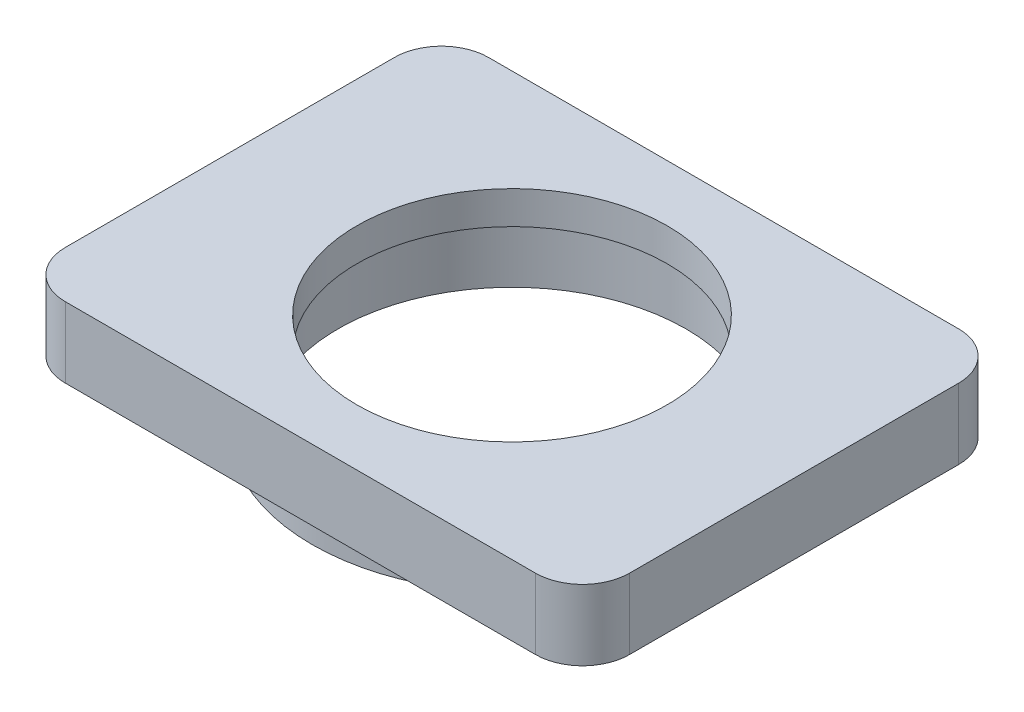
ISO-10303-21;
HEADER;
FILE_DESCRIPTION(('STEP AP214'),'2;1');
FILE_NAME('part.step','',(''),(''),'','','');
FILE_SCHEMA(('AUTOMOTIVE_DESIGN { 1 0 10303 214 1 1 1 1 }'));
ENDSEC;
DATA;
#1=APPLICATION_CONTEXT('core data for automotive mechanical design processes');
#2=APPLICATION_PROTOCOL_DEFINITION('international standard','automotive_design',2000,#1);
#3=PRODUCT_CONTEXT('',#1,'mechanical');
#4=PRODUCT('Part','Part','',(#3));
#5=PRODUCT_RELATED_PRODUCT_CATEGORY('part','',(#4));
#6=PRODUCT_DEFINITION_FORMATION('','',#4);
#7=PRODUCT_DEFINITION_CONTEXT('part definition',#1,'design');
#8=PRODUCT_DEFINITION('design','',#6,#7);
#9=PRODUCT_DEFINITION_SHAPE('','',#8);
#10=(LENGTH_UNIT() NAMED_UNIT(*) SI_UNIT(.MILLI.,.METRE.));
#11=(NAMED_UNIT(*) PLANE_ANGLE_UNIT() SI_UNIT($,.RADIAN.));
#12=(NAMED_UNIT(*) SI_UNIT($,.STERADIAN.) SOLID_ANGLE_UNIT());
#13=UNCERTAINTY_MEASURE_WITH_UNIT(LENGTH_MEASURE(1.E-05),#10,'distance_accuracy_value','');
#14=(GEOMETRIC_REPRESENTATION_CONTEXT(3) GLOBAL_UNCERTAINTY_ASSIGNED_CONTEXT((#13)) GLOBAL_UNIT_ASSIGNED_CONTEXT((#10,
#11,#12)) REPRESENTATION_CONTEXT('',''));
#15=CARTESIAN_POINT('',(0.,0.,0.));
#16=DIRECTION('',(0.,0.,1.));
#17=DIRECTION('',(1.,0.,0.));
#18=AXIS2_PLACEMENT_3D('',#15,#16,#17);
#19=CARTESIAN_POINT('',(0.,10.5,0.));
#20=DIRECTION('',(0.,-1.,0.));
#21=DIRECTION('',(0.,0.,-1.));
#22=AXIS2_PLACEMENT_3D('',#19,#20,#21);
#23=CYLINDRICAL_SURFACE('',#22,16.5);
#24=CARTESIAN_POINT('',(0.,10.5,0.));
#25=DIRECTION('',(0.,1.,0.));
#26=DIRECTION('',(0.,0.,1.));
#27=AXIS2_PLACEMENT_3D('',#24,#25,#26);
#28=CIRCLE('',#27,16.5);
#29=CARTESIAN_POINT('',(0.,10.5,16.5));
#30=VERTEX_POINT('',#29);
#31=EDGE_CURVE('E164',#30,#30,#28,.T.);
#32=ORIENTED_EDGE('',*,*,#31,.T.);
#33=EDGE_LOOP('',(#32));
#34=FACE_BOUND('',#33,.T.);
#35=CARTESIAN_POINT('',(0.,7.,0.));
#36=DIRECTION('',(0.,-1.,0.));
#37=DIRECTION('',(0.,0.,-1.));
#38=AXIS2_PLACEMENT_3D('',#35,#36,#37);
#39=CIRCLE('',#38,16.5);
#40=CARTESIAN_POINT('',(0.,7.,-16.5));
#41=VERTEX_POINT('',#40);
#42=EDGE_CURVE('E38',#41,#41,#39,.T.);
#43=ORIENTED_EDGE('',*,*,#42,.T.);
#44=EDGE_LOOP('',(#43));
#45=FACE_BOUND('',#44,.T.);
#46=ADVANCED_FACE('F34',(#34,#45),#23,.F.);
#47=CARTESIAN_POINT('',(0.,0.,0.));
#48=DIRECTION('',(0.,1.,0.));
#49=DIRECTION('',(0.,0.,1.));
#50=AXIS2_PLACEMENT_3D('',#47,#48,#49);
#51=PLANE('',#50);
#52=CARTESIAN_POINT('',(0.,0.,0.));
#53=DIRECTION('',(0.,1.,0.));
#54=DIRECTION('',(0.,0.,1.));
#55=AXIS2_PLACEMENT_3D('',#52,#53,#54);
#56=CIRCLE('',#55,21.25);
#57=CARTESIAN_POINT('',(0.,0.,21.25));
#58=VERTEX_POINT('',#57);
#59=EDGE_CURVE('E128',#58,#58,#56,.T.);
#60=ORIENTED_EDGE('',*,*,#59,.F.);
#61=EDGE_LOOP('',(#60));
#62=FACE_BOUND('',#61,.T.);
#63=CARTESIAN_POINT('',(0.,0.,0.));
#64=DIRECTION('',(0.,1.,0.));
#65=DIRECTION('',(0.,0.,1.));
#66=AXIS2_PLACEMENT_3D('',#63,#64,#65);
#67=CIRCLE('',#66,18.5);
#68=CARTESIAN_POINT('',(0.,0.,18.5));
#69=VERTEX_POINT('',#68);
#70=EDGE_CURVE('E133',#69,#69,#67,.T.);
#71=ORIENTED_EDGE('',*,*,#70,.T.);
#72=EDGE_LOOP('',(#71));
#73=FACE_BOUND('',#72,.T.);
#74=ADVANCED_FACE('F181',(#62,#73),#51,.F.);
#75=CARTESIAN_POINT('',(0.,8.,0.));
#76=DIRECTION('',(0.,-1.,0.));
#77=DIRECTION('',(0.,0.,-1.));
#78=AXIS2_PLACEMENT_3D('',#75,#76,#77);
#79=CYLINDRICAL_SURFACE('',#78,21.25);
#80=CARTESIAN_POINT('',(0.,3.,0.));
#81=DIRECTION('',(0.,-1.,0.));
#82=DIRECTION('',(0.,0.,-1.));
#83=AXIS2_PLACEMENT_3D('',#80,#81,#82);
#84=CIRCLE('',#83,21.25);
#85=CARTESIAN_POINT('',(0.,3.,-21.25));
#86=VERTEX_POINT('',#85);
#87=EDGE_CURVE('E160',#86,#86,#84,.T.);
#88=ORIENTED_EDGE('',*,*,#87,.T.);
#89=EDGE_LOOP('',(#88));
#90=FACE_BOUND('',#89,.T.);
#91=ORIENTED_EDGE('',*,*,#59,.T.);
#92=EDGE_LOOP('',(#91));
#93=FACE_BOUND('',#92,.T.);
#94=ADVANCED_FACE('F187',(#90,#93),#79,.T.);
#95=CARTESIAN_POINT('',(0.,8.,0.));
#96=DIRECTION('',(0.,-1.,0.));
#97=DIRECTION('',(0.,0.,-1.));
#98=AXIS2_PLACEMENT_3D('',#95,#96,#97);
#99=CYLINDRICAL_SURFACE('',#98,18.5);
#100=ORIENTED_EDGE('',*,*,#70,.F.);
#101=EDGE_LOOP('',(#100));
#102=FACE_BOUND('',#101,.T.);
#103=CARTESIAN_POINT('',(0.,7.,0.));
#104=DIRECTION('',(0.,-1.,0.));
#105=DIRECTION('',(0.,0.,-1.));
#106=AXIS2_PLACEMENT_3D('',#103,#104,#105);
#107=CIRCLE('',#106,18.5);
#108=CARTESIAN_POINT('',(0.,7.,-18.5));
#109=VERTEX_POINT('',#108);
#110=EDGE_CURVE('E191',#109,#109,#107,.T.);
#111=ORIENTED_EDGE('',*,*,#110,.F.);
#112=EDGE_LOOP('',(#111));
#113=FACE_BOUND('',#112,.T.);
#114=ADVANCED_FACE('F183',(#102,#113),#99,.F.);
#115=CARTESIAN_POINT('',(0.,3.,0.));
#116=DIRECTION('',(0.,-1.,0.));
#117=DIRECTION('',(0.,0.,-1.));
#118=AXIS2_PLACEMENT_3D('',#115,#116,#117);
#119=PLANE('',#118);
#120=CARTESIAN_POINT('',(-25.,3.,-17.5));
#121=DIRECTION('',(0.,-1.,0.));
#122=DIRECTION('',(0.,0.,-1.));
#123=AXIS2_PLACEMENT_3D('',#120,#121,#122);
#124=CIRCLE('',#123,1.75);
#125=CARTESIAN_POINT('',(-25.,3.,-19.25));
#126=VERTEX_POINT('',#125);
#127=EDGE_CURVE('E408',#126,#126,#124,.T.);
#128=ORIENTED_EDGE('',*,*,#127,.F.);
#129=EDGE_LOOP('',(#128));
#130=FACE_BOUND('',#129,.T.);
#131=CARTESIAN_POINT('',(25.,3.,-17.5));
#132=DIRECTION('',(0.,-1.,0.));
#133=DIRECTION('',(0.,0.,-1.));
#134=AXIS2_PLACEMENT_3D('',#131,#132,#133);
#135=CIRCLE('',#134,1.75);
#136=CARTESIAN_POINT('',(25.,3.,-19.25));
#137=VERTEX_POINT('',#136);
#138=EDGE_CURVE('E407',#137,#137,#135,.T.);
#139=ORIENTED_EDGE('',*,*,#138,.F.);
#140=EDGE_LOOP('',(#139));
#141=FACE_BOUND('',#140,.T.);
#142=CARTESIAN_POINT('',(25.,3.,17.5));
#143=DIRECTION('',(0.,-1.,0.));
#144=DIRECTION('',(0.,0.,-1.));
#145=AXIS2_PLACEMENT_3D('',#142,#143,#144);
#146=CIRCLE('',#145,1.75);
#147=CARTESIAN_POINT('',(25.,3.,15.75));
#148=VERTEX_POINT('',#147);
#149=EDGE_CURVE('E418',#148,#148,#146,.T.);
#150=ORIENTED_EDGE('',*,*,#149,.F.);
#151=EDGE_LOOP('',(#150));
#152=FACE_BOUND('',#151,.T.);
#153=CARTESIAN_POINT('',(-25.,3.,17.5));
#154=DIRECTION('',(0.,-1.,0.));
#155=DIRECTION('',(0.,0.,-1.));
#156=AXIS2_PLACEMENT_3D('',#153,#154,#155);
#157=CIRCLE('',#156,1.75);
#158=CARTESIAN_POINT('',(-25.,3.,15.75));
#159=VERTEX_POINT('',#158);
#160=EDGE_CURVE('E197',#159,#159,#157,.T.);
#161=ORIENTED_EDGE('',*,*,#160,.F.);
#162=EDGE_LOOP('',(#161));
#163=FACE_BOUND('',#162,.T.);
#164=ORIENTED_EDGE('',*,*,#87,.F.);
#165=EDGE_LOOP('',(#164));
#166=FACE_BOUND('',#165,.T.);
#167=DIRECTION('',(-1.,0.,0.));
#168=VECTOR('',#167,1.);
#169=CARTESIAN_POINT('',(-30.,3.,-22.5));
#170=LINE('',#169,#168);
#171=CARTESIAN_POINT('',(25.,3.,-22.5));
#172=VERTEX_POINT('',#171);
#173=CARTESIAN_POINT('',(-25.,3.,-22.5));
#174=VERTEX_POINT('',#173);
#175=EDGE_CURVE('E166',#172,#174,#170,.T.);
#176=ORIENTED_EDGE('',*,*,#175,.F.);
#177=CARTESIAN_POINT('',(25.,3.,-17.5));
#178=DIRECTION('',(0.,-1.,0.));
#179=DIRECTION('',(0.,0.,-1.));
#180=AXIS2_PLACEMENT_3D('',#177,#178,#179);
#181=CIRCLE('',#180,5.);
#182=CARTESIAN_POINT('',(30.,3.,-17.5));
#183=VERTEX_POINT('',#182);
#184=EDGE_CURVE('E149',#172,#183,#181,.T.);
#185=ORIENTED_EDGE('',*,*,#184,.T.);
#186=DIRECTION('',(0.,0.,-1.));
#187=VECTOR('',#186,1.);
#188=CARTESIAN_POINT('',(30.,3.,22.5));
#189=LINE('',#188,#187);
#190=CARTESIAN_POINT('',(30.,3.,17.5));
#191=VERTEX_POINT('',#190);
#192=EDGE_CURVE('E175',#191,#183,#189,.T.);
#193=ORIENTED_EDGE('',*,*,#192,.F.);
#194=CARTESIAN_POINT('',(25.,3.,17.5));
#195=DIRECTION('',(0.,-1.,0.));
#196=DIRECTION('',(0.,0.,-1.));
#197=AXIS2_PLACEMENT_3D('',#194,#195,#196);
#198=CIRCLE('',#197,5.);
#199=CARTESIAN_POINT('',(25.,3.,22.5));
#200=VERTEX_POINT('',#199);
#201=EDGE_CURVE('E127',#191,#200,#198,.T.);
#202=ORIENTED_EDGE('',*,*,#201,.T.);
#203=DIRECTION('',(1.,0.,0.));
#204=VECTOR('',#203,1.);
#205=CARTESIAN_POINT('',(-30.,3.,22.5));
#206=LINE('',#205,#204);
#207=CARTESIAN_POINT('',(-25.,3.,22.5));
#208=VERTEX_POINT('',#207);
#209=EDGE_CURVE('E159',#208,#200,#206,.T.);
#210=ORIENTED_EDGE('',*,*,#209,.F.);
#211=CARTESIAN_POINT('',(-25.,3.,17.5));
#212=DIRECTION('',(0.,-1.,0.));
#213=DIRECTION('',(0.,0.,-1.));
#214=AXIS2_PLACEMENT_3D('',#211,#212,#213);
#215=CIRCLE('',#214,5.);
#216=CARTESIAN_POINT('',(-30.,3.,17.5));
#217=VERTEX_POINT('',#216);
#218=EDGE_CURVE('E50',#208,#217,#215,.T.);
#219=ORIENTED_EDGE('',*,*,#218,.T.);
#220=DIRECTION('',(0.,0.,1.));
#221=VECTOR('',#220,1.);
#222=CARTESIAN_POINT('',(-30.,3.,22.5));
#223=LINE('',#222,#221);
#224=CARTESIAN_POINT('',(-30.,3.,-17.5));
#225=VERTEX_POINT('',#224);
#226=EDGE_CURVE('E161',#225,#217,#223,.T.);
#227=ORIENTED_EDGE('',*,*,#226,.F.);
#228=CARTESIAN_POINT('',(-25.,3.,-17.5));
#229=DIRECTION('',(0.,-1.,0.));
#230=DIRECTION('',(0.,0.,-1.));
#231=AXIS2_PLACEMENT_3D('',#228,#229,#230);
#232=CIRCLE('',#231,5.);
#233=EDGE_CURVE('E145',#225,#174,#232,.T.);
#234=ORIENTED_EDGE('',*,*,#233,.T.);
#235=EDGE_LOOP('',(#176,#185,#193,#202,#210,#219,#227,#234));
#236=FACE_BOUND('',#235,.T.);
#237=ADVANCED_FACE('F186',(#130,#141,#152,#163,#166,#236),#119,.T.);
#238=CARTESIAN_POINT('',(-30.,3.,-22.5));
#239=DIRECTION('',(0.,0.,-1.));
#240=DIRECTION('',(-1.,0.,0.));
#241=AXIS2_PLACEMENT_3D('',#238,#239,#240);
#242=PLANE('',#241);
#243=DIRECTION('',(-1.,0.,0.));
#244=VECTOR('',#243,1.);
#245=CARTESIAN_POINT('',(-30.,10.5,-22.5));
#246=LINE('',#245,#244);
#247=CARTESIAN_POINT('',(25.,10.5,-22.5));
#248=VERTEX_POINT('',#247);
#249=CARTESIAN_POINT('',(-25.,10.5,-22.5));
#250=VERTEX_POINT('',#249);
#251=EDGE_CURVE('E123',#248,#250,#246,.T.);
#252=ORIENTED_EDGE('',*,*,#251,.F.);
#253=DIRECTION('',(0.,1.,0.));
#254=VECTOR('',#253,1.);
#255=CARTESIAN_POINT('',(25.,3.,-22.5));
#256=LINE('',#255,#254);
#257=EDGE_CURVE('E143',#248,#172,#256,.F.);
#258=ORIENTED_EDGE('',*,*,#257,.T.);
#259=ORIENTED_EDGE('',*,*,#175,.T.);
#260=DIRECTION('',(0.,1.,0.));
#261=VECTOR('',#260,1.);
#262=CARTESIAN_POINT('',(-25.,3.,-22.5));
#263=LINE('',#262,#261);
#264=EDGE_CURVE('E140',#174,#250,#263,.T.);
#265=ORIENTED_EDGE('',*,*,#264,.T.);
#266=EDGE_LOOP('',(#252,#258,#259,#265));
#267=FACE_BOUND('',#266,.T.);
#268=ADVANCED_FACE('F206',(#267),#242,.T.);
#269=CARTESIAN_POINT('',(-30.,3.,22.5));
#270=DIRECTION('',(-1.,0.,0.));
#271=DIRECTION('',(0.,0.,1.));
#272=AXIS2_PLACEMENT_3D('',#269,#270,#271);
#273=PLANE('',#272);
#274=ORIENTED_EDGE('',*,*,#226,.T.);
#275=DIRECTION('',(0.,1.,0.));
#276=VECTOR('',#275,1.);
#277=CARTESIAN_POINT('',(-30.,3.,17.5));
#278=LINE('',#277,#276);
#279=CARTESIAN_POINT('',(-30.,10.5,17.5));
#280=VERTEX_POINT('',#279);
#281=EDGE_CURVE('E11',#217,#280,#278,.T.);
#282=ORIENTED_EDGE('',*,*,#281,.T.);
#283=DIRECTION('',(0.,0.,1.));
#284=VECTOR('',#283,1.);
#285=CARTESIAN_POINT('',(-30.,10.5,22.5));
#286=LINE('',#285,#284);
#287=CARTESIAN_POINT('',(-30.,10.5,-17.5));
#288=VERTEX_POINT('',#287);
#289=EDGE_CURVE('E172',#288,#280,#286,.T.);
#290=ORIENTED_EDGE('',*,*,#289,.F.);
#291=DIRECTION('',(0.,1.,0.));
#292=VECTOR('',#291,1.);
#293=CARTESIAN_POINT('',(-30.,3.,-17.5));
#294=LINE('',#293,#292);
#295=EDGE_CURVE('E43',#288,#225,#294,.F.);
#296=ORIENTED_EDGE('',*,*,#295,.T.);
#297=EDGE_LOOP('',(#274,#282,#290,#296));
#298=FACE_BOUND('',#297,.T.);
#299=ADVANCED_FACE('F211',(#298),#273,.T.);
#300=CARTESIAN_POINT('',(-30.,3.,22.5));
#301=DIRECTION('',(0.,0.,1.));
#302=DIRECTION('',(1.,0.,0.));
#303=AXIS2_PLACEMENT_3D('',#300,#301,#302);
#304=PLANE('',#303);
#305=ORIENTED_EDGE('',*,*,#209,.T.);
#306=DIRECTION('',(0.,1.,0.));
#307=VECTOR('',#306,1.);
#308=CARTESIAN_POINT('',(25.,3.,22.5));
#309=LINE('',#308,#307);
#310=CARTESIAN_POINT('',(25.,10.5,22.5));
#311=VERTEX_POINT('',#310);
#312=EDGE_CURVE('E153',#200,#311,#309,.T.);
#313=ORIENTED_EDGE('',*,*,#312,.T.);
#314=DIRECTION('',(1.,0.,0.));
#315=VECTOR('',#314,1.);
#316=CARTESIAN_POINT('',(-30.,10.5,22.5));
#317=LINE('',#316,#315);
#318=CARTESIAN_POINT('',(-25.,10.5,22.5));
#319=VERTEX_POINT('',#318);
#320=EDGE_CURVE('E107',#319,#311,#317,.T.);
#321=ORIENTED_EDGE('',*,*,#320,.F.);
#322=DIRECTION('',(0.,1.,0.));
#323=VECTOR('',#322,1.);
#324=CARTESIAN_POINT('',(-25.,3.,22.5));
#325=LINE('',#324,#323);
#326=EDGE_CURVE('E151',#319,#208,#325,.F.);
#327=ORIENTED_EDGE('',*,*,#326,.T.);
#328=EDGE_LOOP('',(#305,#313,#321,#327));
#329=FACE_BOUND('',#328,.T.);
#330=ADVANCED_FACE('F157',(#329),#304,.T.);
#331=CARTESIAN_POINT('',(30.,3.,22.5));
#332=DIRECTION('',(1.,0.,0.));
#333=DIRECTION('',(0.,0.,-1.));
#334=AXIS2_PLACEMENT_3D('',#331,#332,#333);
#335=PLANE('',#334);
#336=ORIENTED_EDGE('',*,*,#192,.T.);
#337=DIRECTION('',(0.,1.,0.));
#338=VECTOR('',#337,1.);
#339=CARTESIAN_POINT('',(30.,3.,-17.5));
#340=LINE('',#339,#338);
#341=CARTESIAN_POINT('',(30.,10.5,-17.5));
#342=VERTEX_POINT('',#341);
#343=EDGE_CURVE('E122',#183,#342,#340,.T.);
#344=ORIENTED_EDGE('',*,*,#343,.T.);
#345=DIRECTION('',(0.,0.,-1.));
#346=VECTOR('',#345,1.);
#347=CARTESIAN_POINT('',(30.,10.5,22.5));
#348=LINE('',#347,#346);
#349=CARTESIAN_POINT('',(30.,10.5,17.5));
#350=VERTEX_POINT('',#349);
#351=EDGE_CURVE('E105',#350,#342,#348,.T.);
#352=ORIENTED_EDGE('',*,*,#351,.F.);
#353=DIRECTION('',(0.,1.,0.));
#354=VECTOR('',#353,1.);
#355=CARTESIAN_POINT('',(30.,3.,17.5));
#356=LINE('',#355,#354);
#357=EDGE_CURVE('E119',#350,#191,#356,.F.);
#358=ORIENTED_EDGE('',*,*,#357,.T.);
#359=EDGE_LOOP('',(#336,#344,#352,#358));
#360=FACE_BOUND('',#359,.T.);
#361=ADVANCED_FACE('F118',(#360),#335,.T.);
#362=CARTESIAN_POINT('',(0.,10.5,0.));
#363=DIRECTION('',(0.,1.,0.));
#364=DIRECTION('',(0.,0.,1.));
#365=AXIS2_PLACEMENT_3D('',#362,#363,#364);
#366=PLANE('',#365);
#367=ORIENTED_EDGE('',*,*,#351,.T.);
#368=CARTESIAN_POINT('',(25.,10.5,-17.5));
#369=DIRECTION('',(0.,1.,0.));
#370=DIRECTION('',(0.,0.,1.));
#371=AXIS2_PLACEMENT_3D('',#368,#369,#370);
#372=CIRCLE('',#371,5.);
#373=EDGE_CURVE('E112',#342,#248,#372,.T.);
#374=ORIENTED_EDGE('',*,*,#373,.T.);
#375=ORIENTED_EDGE('',*,*,#251,.T.);
#376=CARTESIAN_POINT('',(-25.,10.5,-17.5));
#377=DIRECTION('',(0.,1.,0.));
#378=DIRECTION('',(0.,0.,1.));
#379=AXIS2_PLACEMENT_3D('',#376,#377,#378);
#380=CIRCLE('',#379,5.);
#381=EDGE_CURVE('E130',#250,#288,#380,.T.);
#382=ORIENTED_EDGE('',*,*,#381,.T.);
#383=ORIENTED_EDGE('',*,*,#289,.T.);
#384=CARTESIAN_POINT('',(-25.,10.5,17.5));
#385=DIRECTION('',(0.,1.,0.));
#386=DIRECTION('',(0.,0.,1.));
#387=AXIS2_PLACEMENT_3D('',#384,#385,#386);
#388=CIRCLE('',#387,5.);
#389=EDGE_CURVE('E113',#280,#319,#388,.T.);
#390=ORIENTED_EDGE('',*,*,#389,.T.);
#391=ORIENTED_EDGE('',*,*,#320,.T.);
#392=CARTESIAN_POINT('',(25.,10.5,17.5));
#393=DIRECTION('',(0.,1.,0.));
#394=DIRECTION('',(0.,0.,1.));
#395=AXIS2_PLACEMENT_3D('',#392,#393,#394);
#396=CIRCLE('',#395,5.);
#397=EDGE_CURVE('E101',#311,#350,#396,.T.);
#398=ORIENTED_EDGE('',*,*,#397,.T.);
#399=EDGE_LOOP('',(#367,#374,#375,#382,#383,#390,#391,#398));
#400=FACE_BOUND('',#399,.T.);
#401=ORIENTED_EDGE('',*,*,#31,.F.);
#402=EDGE_LOOP('',(#401));
#403=FACE_BOUND('',#402,.T.);
#404=ADVANCED_FACE('F103',(#400,#403),#366,.T.);
#405=CARTESIAN_POINT('',(25.,3.,-17.5));
#406=DIRECTION('',(0.,1.,0.));
#407=DIRECTION('',(0.,0.,1.));
#408=AXIS2_PLACEMENT_3D('',#405,#406,#407);
#409=CYLINDRICAL_SURFACE('',#408,5.);
#410=ORIENTED_EDGE('',*,*,#184,.F.);
#411=ORIENTED_EDGE('',*,*,#257,.F.);
#412=ORIENTED_EDGE('',*,*,#373,.F.);
#413=ORIENTED_EDGE('',*,*,#343,.F.);
#414=EDGE_LOOP('',(#410,#411,#412,#413));
#415=FACE_BOUND('',#414,.T.);
#416=ADVANCED_FACE('F221',(#415),#409,.T.);
#417=CARTESIAN_POINT('',(25.,3.,17.5));
#418=DIRECTION('',(0.,1.,0.));
#419=DIRECTION('',(0.,0.,1.));
#420=AXIS2_PLACEMENT_3D('',#417,#418,#419);
#421=CYLINDRICAL_SURFACE('',#420,5.);
#422=ORIENTED_EDGE('',*,*,#201,.F.);
#423=ORIENTED_EDGE('',*,*,#357,.F.);
#424=ORIENTED_EDGE('',*,*,#397,.F.);
#425=ORIENTED_EDGE('',*,*,#312,.F.);
#426=EDGE_LOOP('',(#422,#423,#424,#425));
#427=FACE_BOUND('',#426,.T.);
#428=ADVANCED_FACE('F126',(#427),#421,.T.);
#429=CARTESIAN_POINT('',(-25.,3.,17.5));
#430=DIRECTION('',(0.,1.,0.));
#431=DIRECTION('',(0.,0.,1.));
#432=AXIS2_PLACEMENT_3D('',#429,#430,#431);
#433=CYLINDRICAL_SURFACE('',#432,5.);
#434=ORIENTED_EDGE('',*,*,#218,.F.);
#435=ORIENTED_EDGE('',*,*,#326,.F.);
#436=ORIENTED_EDGE('',*,*,#389,.F.);
#437=ORIENTED_EDGE('',*,*,#281,.F.);
#438=EDGE_LOOP('',(#434,#435,#436,#437));
#439=FACE_BOUND('',#438,.T.);
#440=ADVANCED_FACE('F214',(#439),#433,.T.);
#441=CARTESIAN_POINT('',(-25.,3.,-17.5));
#442=DIRECTION('',(0.,1.,0.));
#443=DIRECTION('',(0.,0.,1.));
#444=AXIS2_PLACEMENT_3D('',#441,#442,#443);
#445=CYLINDRICAL_SURFACE('',#444,5.);
#446=ORIENTED_EDGE('',*,*,#233,.F.);
#447=ORIENTED_EDGE('',*,*,#295,.F.);
#448=ORIENTED_EDGE('',*,*,#381,.F.);
#449=ORIENTED_EDGE('',*,*,#264,.F.);
#450=EDGE_LOOP('',(#446,#447,#448,#449));
#451=FACE_BOUND('',#450,.T.);
#452=ADVANCED_FACE('F36',(#451),#445,.T.);
#453=CARTESIAN_POINT('',(0.,7.,0.));
#454=DIRECTION('',(0.,-1.,0.));
#455=DIRECTION('',(0.,0.,-1.));
#456=AXIS2_PLACEMENT_3D('',#453,#454,#455);
#457=PLANE('',#456);
#458=ORIENTED_EDGE('',*,*,#42,.F.);
#459=EDGE_LOOP('',(#458));
#460=FACE_BOUND('',#459,.T.);
#461=ORIENTED_EDGE('',*,*,#110,.T.);
#462=EDGE_LOOP('',(#461));
#463=FACE_BOUND('',#462,.T.);
#464=ADVANCED_FACE('F220',(#460,#463),#457,.T.);
#465=CARTESIAN_POINT('',(-25.,9.2,17.5));
#466=DIRECTION('',(0.,-1.,0.));
#467=DIRECTION('',(0.,0.,-1.));
#468=AXIS2_PLACEMENT_3D('',#465,#466,#467);
#469=CYLINDRICAL_SURFACE('',#468,1.75);
#470=CARTESIAN_POINT('',(-25.,9.2,17.5));
#471=DIRECTION('',(0.,-1.,0.));
#472=DIRECTION('',(0.,0.,-1.));
#473=AXIS2_PLACEMENT_3D('',#470,#471,#472);
#474=CIRCLE('',#473,1.75);
#475=CARTESIAN_POINT('',(-25.,9.2,15.75));
#476=VERTEX_POINT('',#475);
#477=EDGE_CURVE('E193',#476,#476,#474,.T.);
#478=CARTESIAN_POINT('',(-25.,9.2,15.75));
#479=CARTESIAN_POINT('',(-25.,9.13541666666667,15.75));
#480=CARTESIAN_POINT('',(-25.,9.07083333333333,15.75));
#481=CARTESIAN_POINT('',(-25.,8.94166666666667,15.75));
#482=CARTESIAN_POINT('',(-25.,8.87708333333333,15.75));
#483=CARTESIAN_POINT('',(-25.,8.74791666666667,15.75));
#484=CARTESIAN_POINT('',(-25.,8.68333333333334,15.75));
#485=CARTESIAN_POINT('',(-25.,8.55416666666667,15.75));
#486=CARTESIAN_POINT('',(-25.,8.48958333333333,15.75));
#487=CARTESIAN_POINT('',(-25.,8.36041666666667,15.75));
#488=CARTESIAN_POINT('',(-25.,8.29583333333333,15.75));
#489=CARTESIAN_POINT('',(-25.,8.16666666666667,15.75));
#490=CARTESIAN_POINT('',(-25.,8.10208333333333,15.75));
#491=CARTESIAN_POINT('',(-25.,7.97291666666667,15.75));
#492=CARTESIAN_POINT('',(-25.,7.90833333333333,15.75));
#493=CARTESIAN_POINT('',(-25.,7.77916666666667,15.75));
#494=CARTESIAN_POINT('',(-25.,7.71458333333333,15.75));
#495=CARTESIAN_POINT('',(-25.,7.58541666666667,15.75));
#496=CARTESIAN_POINT('',(-25.,7.52083333333333,15.75));
#497=CARTESIAN_POINT('',(-25.,7.39166666666667,15.75));
#498=CARTESIAN_POINT('',(-25.,7.32708333333333,15.75));
#499=CARTESIAN_POINT('',(-25.,7.19791666666667,15.75));
#500=CARTESIAN_POINT('',(-25.,7.13333333333333,15.75));
#501=CARTESIAN_POINT('',(-25.,7.00416666666667,15.75));
#502=CARTESIAN_POINT('',(-25.,6.93958333333333,15.75));
#503=CARTESIAN_POINT('',(-25.,6.81041666666667,15.75));
#504=CARTESIAN_POINT('',(-25.,6.74583333333333,15.75));
#505=CARTESIAN_POINT('',(-25.,6.61666666666667,15.75));
#506=CARTESIAN_POINT('',(-25.,6.55208333333333,15.75));
#507=CARTESIAN_POINT('',(-25.,6.42291666666667,15.75));
#508=CARTESIAN_POINT('',(-25.,6.35833333333333,15.75));
#509=CARTESIAN_POINT('',(-25.,6.22916666666667,15.75));
#510=CARTESIAN_POINT('',(-25.,6.16458333333333,15.75));
#511=CARTESIAN_POINT('',(-25.,6.03541666666667,15.75));
#512=CARTESIAN_POINT('',(-25.,5.97083333333333,15.75));
#513=CARTESIAN_POINT('',(-25.,5.84166666666667,15.75));
#514=CARTESIAN_POINT('',(-25.,5.77708333333333,15.75));
#515=CARTESIAN_POINT('',(-25.,5.64791666666667,15.75));
#516=CARTESIAN_POINT('',(-25.,5.58333333333333,15.75));
#517=CARTESIAN_POINT('',(-25.,5.45416666666667,15.75));
#518=CARTESIAN_POINT('',(-25.,5.38958333333334,15.75));
#519=CARTESIAN_POINT('',(-25.,5.26041666666667,15.75));
#520=CARTESIAN_POINT('',(-25.,5.19583333333334,15.75));
#521=CARTESIAN_POINT('',(-25.,5.06666666666667,15.75));
#522=CARTESIAN_POINT('',(-25.,5.00208333333333,15.75));
#523=CARTESIAN_POINT('',(-25.,4.87291666666667,15.75));
#524=CARTESIAN_POINT('',(-25.,4.80833333333333,15.75));
#525=CARTESIAN_POINT('',(-25.,4.67916666666667,15.75));
#526=CARTESIAN_POINT('',(-25.,4.61458333333333,15.75));
#527=CARTESIAN_POINT('',(-25.,4.48541666666667,15.75));
#528=CARTESIAN_POINT('',(-25.,4.42083333333334,15.75));
#529=CARTESIAN_POINT('',(-25.,4.29166666666667,15.75));
#530=CARTESIAN_POINT('',(-25.,4.22708333333334,15.75));
#531=CARTESIAN_POINT('',(-25.,4.09791666666667,15.75));
#532=CARTESIAN_POINT('',(-25.,4.03333333333333,15.75));
#533=CARTESIAN_POINT('',(-25.,3.90416666666667,15.75));
#534=CARTESIAN_POINT('',(-25.,3.83958333333333,15.75));
#535=CARTESIAN_POINT('',(-25.,3.71041666666667,15.75));
#536=CARTESIAN_POINT('',(-25.,3.64583333333334,15.75));
#537=CARTESIAN_POINT('',(-25.,3.51666666666667,15.75));
#538=CARTESIAN_POINT('',(-25.,3.45208333333334,15.75));
#539=CARTESIAN_POINT('',(-25.,3.32291666666667,15.75));
#540=CARTESIAN_POINT('',(-25.,3.25833333333334,15.75));
#541=CARTESIAN_POINT('',(-25.,3.12916666666667,15.75));
#542=CARTESIAN_POINT('',(-25.,3.06458333333334,15.75));
#543=CARTESIAN_POINT('',(-25.,3.,15.75));
#544=B_SPLINE_CURVE_WITH_KNOTS('',3,(#478,#479,#480,#481,#482,#483,#484,#485,#486,#487,#488,
#489,#490,#491,#492,#493,#494,#495,#496,#497,#498,#499,#500,#501,#502,#503,#504,#505,#506,#507,
#508,#509,#510,#511,#512,#513,#514,#515,#516,#517,#518,#519,#520,#521,#522,#523,#524,#525,#526,
#527,#528,#529,#530,#531,#532,#533,#534,#535,#536,#537,#538,#539,#540,#541,#542,#543),
.UNSPECIFIED.,.F.,.F.,(4,2,2,2,2,2,2,2,2,2,2,2,2,2,2,2,2,2,2,2,2,2,2,2,2,2,2,2,2,2,2,2,4),(0.,
0.193750000000001,0.387500000000001,0.58125,0.775000000000001,0.968750000000001,1.1625,1.35625,
1.55,1.74375,1.9375,2.13125,2.325,2.51875,2.7125,2.90625,3.1,3.29375,3.4875,3.68125,3.875,
4.06875,4.2625,4.45625,4.65,4.84375,5.0375,5.23125,5.425,5.61875,5.8125,6.00625,6.2),.UNSPECIFIED.);
#545=EDGE_CURVE('BSEAM316',#476,#159,#544,.T.);
#546=ORIENTED_EDGE('',*,*,#477,.F.);
#547=ORIENTED_EDGE('',*,*,#160,.T.);
#548=ORIENTED_EDGE('',*,*,#545,.T.);
#549=ORIENTED_EDGE('',*,*,#545,.F.);
#550=EDGE_LOOP('',(#546,#548,#547,#549));
#551=FACE_BOUND('',#550,.T.);
#552=ADVANCED_FACE('F316',(#551),#469,.F.);
#553=CARTESIAN_POINT('',(-25.,9.2,17.5));
#554=DIRECTION('',(0.,-1.,0.));
#555=DIRECTION('',(0.,0.,-1.));
#556=AXIS2_PLACEMENT_3D('',#553,#554,#555);
#557=PLANE('',#556);
#558=ORIENTED_EDGE('',*,*,#477,.T.);
#559=EDGE_LOOP('',(#558));
#560=FACE_BOUND('',#559,.T.);
#561=ADVANCED_FACE('F331',(#560),#557,.T.);
#562=CARTESIAN_POINT('',(25.,9.2,17.5));
#563=DIRECTION('',(0.,-1.,0.));
#564=DIRECTION('',(0.,0.,-1.));
#565=AXIS2_PLACEMENT_3D('',#562,#563,#564);
#566=CYLINDRICAL_SURFACE('',#565,1.75);
#567=CARTESIAN_POINT('',(25.,9.2,17.5));
#568=DIRECTION('',(0.,-1.,0.));
#569=DIRECTION('',(0.,0.,-1.));
#570=AXIS2_PLACEMENT_3D('',#567,#568,#569);
#571=CIRCLE('',#570,1.75);
#572=CARTESIAN_POINT('',(25.,9.2,15.75));
#573=VERTEX_POINT('',#572);
#574=EDGE_CURVE('E421',#573,#573,#571,.T.);
#575=CARTESIAN_POINT('',(25.,9.2,15.75));
#576=CARTESIAN_POINT('',(25.,9.13541666666667,15.75));
#577=CARTESIAN_POINT('',(25.,9.07083333333333,15.75));
#578=CARTESIAN_POINT('',(25.,8.94166666666667,15.75));
#579=CARTESIAN_POINT('',(25.,8.87708333333333,15.75));
#580=CARTESIAN_POINT('',(25.,8.74791666666667,15.75));
#581=CARTESIAN_POINT('',(25.,8.68333333333334,15.75));
#582=CARTESIAN_POINT('',(25.,8.55416666666667,15.75));
#583=CARTESIAN_POINT('',(25.,8.48958333333333,15.75));
#584=CARTESIAN_POINT('',(25.,8.36041666666667,15.75));
#585=CARTESIAN_POINT('',(25.,8.29583333333333,15.75));
#586=CARTESIAN_POINT('',(25.,8.16666666666667,15.75));
#587=CARTESIAN_POINT('',(25.,8.10208333333333,15.75));
#588=CARTESIAN_POINT('',(25.,7.97291666666667,15.75));
#589=CARTESIAN_POINT('',(25.,7.90833333333333,15.75));
#590=CARTESIAN_POINT('',(25.,7.77916666666667,15.75));
#591=CARTESIAN_POINT('',(25.,7.71458333333333,15.75));
#592=CARTESIAN_POINT('',(25.,7.58541666666667,15.75));
#593=CARTESIAN_POINT('',(25.,7.52083333333333,15.75));
#594=CARTESIAN_POINT('',(25.,7.39166666666667,15.75));
#595=CARTESIAN_POINT('',(25.,7.32708333333333,15.75));
#596=CARTESIAN_POINT('',(25.,7.19791666666667,15.75));
#597=CARTESIAN_POINT('',(25.,7.13333333333333,15.75));
#598=CARTESIAN_POINT('',(25.,7.00416666666667,15.75));
#599=CARTESIAN_POINT('',(25.,6.93958333333333,15.75));
#600=CARTESIAN_POINT('',(25.,6.81041666666667,15.75));
#601=CARTESIAN_POINT('',(25.,6.74583333333333,15.75));
#602=CARTESIAN_POINT('',(25.,6.61666666666667,15.75));
#603=CARTESIAN_POINT('',(25.,6.55208333333333,15.75));
#604=CARTESIAN_POINT('',(25.,6.42291666666667,15.75));
#605=CARTESIAN_POINT('',(25.,6.35833333333333,15.75));
#606=CARTESIAN_POINT('',(25.,6.22916666666667,15.75));
#607=CARTESIAN_POINT('',(25.,6.16458333333333,15.75));
#608=CARTESIAN_POINT('',(25.,6.03541666666667,15.75));
#609=CARTESIAN_POINT('',(25.,5.97083333333333,15.75));
#610=CARTESIAN_POINT('',(25.,5.84166666666667,15.75));
#611=CARTESIAN_POINT('',(25.,5.77708333333333,15.75));
#612=CARTESIAN_POINT('',(25.,5.64791666666667,15.75));
#613=CARTESIAN_POINT('',(25.,5.58333333333333,15.75));
#614=CARTESIAN_POINT('',(25.,5.45416666666667,15.75));
#615=CARTESIAN_POINT('',(25.,5.38958333333334,15.75));
#616=CARTESIAN_POINT('',(25.,5.26041666666667,15.75));
#617=CARTESIAN_POINT('',(25.,5.19583333333334,15.75));
#618=CARTESIAN_POINT('',(25.,5.06666666666667,15.75));
#619=CARTESIAN_POINT('',(25.,5.00208333333333,15.75));
#620=CARTESIAN_POINT('',(25.,4.87291666666667,15.75));
#621=CARTESIAN_POINT('',(25.,4.80833333333333,15.75));
#622=CARTESIAN_POINT('',(25.,4.67916666666667,15.75));
#623=CARTESIAN_POINT('',(25.,4.61458333333333,15.75));
#624=CARTESIAN_POINT('',(25.,4.48541666666667,15.75));
#625=CARTESIAN_POINT('',(25.,4.42083333333334,15.75));
#626=CARTESIAN_POINT('',(25.,4.29166666666667,15.75));
#627=CARTESIAN_POINT('',(25.,4.22708333333334,15.75));
#628=CARTESIAN_POINT('',(25.,4.09791666666667,15.75));
#629=CARTESIAN_POINT('',(25.,4.03333333333333,15.75));
#630=CARTESIAN_POINT('',(25.,3.90416666666667,15.75));
#631=CARTESIAN_POINT('',(25.,3.83958333333333,15.75));
#632=CARTESIAN_POINT('',(25.,3.71041666666667,15.75));
#633=CARTESIAN_POINT('',(25.,3.64583333333334,15.75));
#634=CARTESIAN_POINT('',(25.,3.51666666666667,15.75));
#635=CARTESIAN_POINT('',(25.,3.45208333333334,15.75));
#636=CARTESIAN_POINT('',(25.,3.32291666666667,15.75));
#637=CARTESIAN_POINT('',(25.,3.25833333333334,15.75));
#638=CARTESIAN_POINT('',(25.,3.12916666666667,15.75));
#639=CARTESIAN_POINT('',(25.,3.06458333333334,15.75));
#640=CARTESIAN_POINT('',(25.,3.,15.75));
#641=B_SPLINE_CURVE_WITH_KNOTS('',3,(#575,#576,#577,#578,#579,#580,#581,#582,#583,#584,#585,
#586,#587,#588,#589,#590,#591,#592,#593,#594,#595,#596,#597,#598,#599,#600,#601,#602,#603,#604,
#605,#606,#607,#608,#609,#610,#611,#612,#613,#614,#615,#616,#617,#618,#619,#620,#621,#622,#623,
#624,#625,#626,#627,#628,#629,#630,#631,#632,#633,#634,#635,#636,#637,#638,#639,#640),
.UNSPECIFIED.,.F.,.F.,(4,2,2,2,2,2,2,2,2,2,2,2,2,2,2,2,2,2,2,2,2,2,2,2,2,2,2,2,2,2,2,2,4),(0.,
0.193750000000001,0.387500000000001,0.58125,0.775000000000001,0.968750000000001,1.1625,1.35625,
1.55,1.74375,1.9375,2.13125,2.325,2.51875,2.7125,2.90625,3.1,3.29375,3.4875,3.68125,3.875,
4.06875,4.2625,4.45625,4.65,4.84375,5.0375,5.23125,5.425,5.61875,5.8125,6.00625,6.2),.UNSPECIFIED.);
#642=EDGE_CURVE('BSEAM340',#573,#148,#641,.T.);
#643=ORIENTED_EDGE('',*,*,#574,.F.);
#644=ORIENTED_EDGE('',*,*,#149,.T.);
#645=ORIENTED_EDGE('',*,*,#642,.T.);
#646=ORIENTED_EDGE('',*,*,#642,.F.);
#647=EDGE_LOOP('',(#643,#645,#644,#646));
#648=FACE_BOUND('',#647,.T.);
#649=ADVANCED_FACE('F340',(#648),#566,.F.);
#650=CARTESIAN_POINT('',(25.,9.2,17.5));
#651=DIRECTION('',(0.,-1.,0.));
#652=DIRECTION('',(0.,0.,-1.));
#653=AXIS2_PLACEMENT_3D('',#650,#651,#652);
#654=PLANE('',#653);
#655=ORIENTED_EDGE('',*,*,#574,.T.);
#656=EDGE_LOOP('',(#655));
#657=FACE_BOUND('',#656,.T.);
#658=ADVANCED_FACE('F350',(#657),#654,.T.);
#659=CARTESIAN_POINT('',(25.,9.2,-17.5));
#660=DIRECTION('',(0.,-1.,0.));
#661=DIRECTION('',(0.,0.,-1.));
#662=AXIS2_PLACEMENT_3D('',#659,#660,#661);
#663=CYLINDRICAL_SURFACE('',#662,1.75);
#664=CARTESIAN_POINT('',(25.,9.2,-17.5));
#665=DIRECTION('',(0.,-1.,0.));
#666=DIRECTION('',(0.,0.,-1.));
#667=AXIS2_PLACEMENT_3D('',#664,#665,#666);
#668=CIRCLE('',#667,1.75);
#669=CARTESIAN_POINT('',(25.,9.2,-19.25));
#670=VERTEX_POINT('',#669);
#671=EDGE_CURVE('E411',#670,#670,#668,.T.);
#672=CARTESIAN_POINT('',(25.,9.2,-19.25));
#673=CARTESIAN_POINT('',(25.,9.13541666666667,-19.25));
#674=CARTESIAN_POINT('',(25.,9.07083333333333,-19.25));
#675=CARTESIAN_POINT('',(25.,8.94166666666667,-19.25));
#676=CARTESIAN_POINT('',(25.,8.87708333333333,-19.25));
#677=CARTESIAN_POINT('',(25.,8.74791666666667,-19.25));
#678=CARTESIAN_POINT('',(25.,8.68333333333334,-19.25));
#679=CARTESIAN_POINT('',(25.,8.55416666666667,-19.25));
#680=CARTESIAN_POINT('',(25.,8.48958333333333,-19.25));
#681=CARTESIAN_POINT('',(25.,8.36041666666667,-19.25));
#682=CARTESIAN_POINT('',(25.,8.29583333333333,-19.25));
#683=CARTESIAN_POINT('',(25.,8.16666666666667,-19.25));
#684=CARTESIAN_POINT('',(25.,8.10208333333333,-19.25));
#685=CARTESIAN_POINT('',(25.,7.97291666666667,-19.25));
#686=CARTESIAN_POINT('',(25.,7.90833333333333,-19.25));
#687=CARTESIAN_POINT('',(25.,7.77916666666667,-19.25));
#688=CARTESIAN_POINT('',(25.,7.71458333333333,-19.25));
#689=CARTESIAN_POINT('',(25.,7.58541666666667,-19.25));
#690=CARTESIAN_POINT('',(25.,7.52083333333333,-19.25));
#691=CARTESIAN_POINT('',(25.,7.39166666666667,-19.25));
#692=CARTESIAN_POINT('',(25.,7.32708333333333,-19.25));
#693=CARTESIAN_POINT('',(25.,7.19791666666667,-19.25));
#694=CARTESIAN_POINT('',(25.,7.13333333333333,-19.25));
#695=CARTESIAN_POINT('',(25.,7.00416666666667,-19.25));
#696=CARTESIAN_POINT('',(25.,6.93958333333333,-19.25));
#697=CARTESIAN_POINT('',(25.,6.81041666666667,-19.25));
#698=CARTESIAN_POINT('',(25.,6.74583333333333,-19.25));
#699=CARTESIAN_POINT('',(25.,6.61666666666667,-19.25));
#700=CARTESIAN_POINT('',(25.,6.55208333333333,-19.25));
#701=CARTESIAN_POINT('',(25.,6.42291666666667,-19.25));
#702=CARTESIAN_POINT('',(25.,6.35833333333333,-19.25));
#703=CARTESIAN_POINT('',(25.,6.22916666666667,-19.25));
#704=CARTESIAN_POINT('',(25.,6.16458333333333,-19.25));
#705=CARTESIAN_POINT('',(25.,6.03541666666667,-19.25));
#706=CARTESIAN_POINT('',(25.,5.97083333333333,-19.25));
#707=CARTESIAN_POINT('',(25.,5.84166666666667,-19.25));
#708=CARTESIAN_POINT('',(25.,5.77708333333333,-19.25));
#709=CARTESIAN_POINT('',(25.,5.64791666666667,-19.25));
#710=CARTESIAN_POINT('',(25.,5.58333333333333,-19.25));
#711=CARTESIAN_POINT('',(25.,5.45416666666667,-19.25));
#712=CARTESIAN_POINT('',(25.,5.38958333333334,-19.25));
#713=CARTESIAN_POINT('',(25.,5.26041666666667,-19.25));
#714=CARTESIAN_POINT('',(25.,5.19583333333334,-19.25));
#715=CARTESIAN_POINT('',(25.,5.06666666666667,-19.25));
#716=CARTESIAN_POINT('',(25.,5.00208333333333,-19.25));
#717=CARTESIAN_POINT('',(25.,4.87291666666667,-19.25));
#718=CARTESIAN_POINT('',(25.,4.80833333333333,-19.25));
#719=CARTESIAN_POINT('',(25.,4.67916666666667,-19.25));
#720=CARTESIAN_POINT('',(25.,4.61458333333333,-19.25));
#721=CARTESIAN_POINT('',(25.,4.48541666666667,-19.25));
#722=CARTESIAN_POINT('',(25.,4.42083333333334,-19.25));
#723=CARTESIAN_POINT('',(25.,4.29166666666667,-19.25));
#724=CARTESIAN_POINT('',(25.,4.22708333333334,-19.25));
#725=CARTESIAN_POINT('',(25.,4.09791666666667,-19.25));
#726=CARTESIAN_POINT('',(25.,4.03333333333333,-19.25));
#727=CARTESIAN_POINT('',(25.,3.90416666666667,-19.25));
#728=CARTESIAN_POINT('',(25.,3.83958333333333,-19.25));
#729=CARTESIAN_POINT('',(25.,3.71041666666667,-19.25));
#730=CARTESIAN_POINT('',(25.,3.64583333333334,-19.25));
#731=CARTESIAN_POINT('',(25.,3.51666666666667,-19.25));
#732=CARTESIAN_POINT('',(25.,3.45208333333334,-19.25));
#733=CARTESIAN_POINT('',(25.,3.32291666666667,-19.25));
#734=CARTESIAN_POINT('',(25.,3.25833333333334,-19.25));
#735=CARTESIAN_POINT('',(25.,3.12916666666667,-19.25));
#736=CARTESIAN_POINT('',(25.,3.06458333333334,-19.25));
#737=CARTESIAN_POINT('',(25.,3.,-19.25));
#738=B_SPLINE_CURVE_WITH_KNOTS('',3,(#672,#673,#674,#675,#676,#677,#678,#679,#680,#681,#682,
#683,#684,#685,#686,#687,#688,#689,#690,#691,#692,#693,#694,#695,#696,#697,#698,#699,#700,#701,
#702,#703,#704,#705,#706,#707,#708,#709,#710,#711,#712,#713,#714,#715,#716,#717,#718,#719,#720,
#721,#722,#723,#724,#725,#726,#727,#728,#729,#730,#731,#732,#733,#734,#735,#736,#737),
.UNSPECIFIED.,.F.,.F.,(4,2,2,2,2,2,2,2,2,2,2,2,2,2,2,2,2,2,2,2,2,2,2,2,2,2,2,2,2,2,2,2,4),(0.,
0.193750000000001,0.387500000000001,0.58125,0.775000000000001,0.968750000000001,1.1625,1.35625,
1.55,1.74375,1.9375,2.13125,2.325,2.51875,2.7125,2.90625,3.1,3.29375,3.4875,3.68125,3.875,
4.06875,4.2625,4.45625,4.65,4.84375,5.0375,5.23125,5.425,5.61875,5.8125,6.00625,6.2),.UNSPECIFIED.);
#739=EDGE_CURVE('BSEAM360',#670,#137,#738,.T.);
#740=ORIENTED_EDGE('',*,*,#671,.F.);
#741=ORIENTED_EDGE('',*,*,#138,.T.);
#742=ORIENTED_EDGE('',*,*,#739,.T.);
#743=ORIENTED_EDGE('',*,*,#739,.F.);
#744=EDGE_LOOP('',(#740,#742,#741,#743));
#745=FACE_BOUND('',#744,.T.);
#746=ADVANCED_FACE('F360',(#745),#663,.F.);
#747=CARTESIAN_POINT('',(25.,9.2,-17.5));
#748=DIRECTION('',(0.,-1.,0.));
#749=DIRECTION('',(0.,0.,-1.));
#750=AXIS2_PLACEMENT_3D('',#747,#748,#749);
#751=PLANE('',#750);
#752=ORIENTED_EDGE('',*,*,#671,.T.);
#753=EDGE_LOOP('',(#752));
#754=FACE_BOUND('',#753,.T.);
#755=ADVANCED_FACE('F370',(#754),#751,.T.);
#756=CARTESIAN_POINT('',(-25.,9.2,-17.5));
#757=DIRECTION('',(0.,-1.,0.));
#758=DIRECTION('',(0.,0.,-1.));
#759=AXIS2_PLACEMENT_3D('',#756,#757,#758);
#760=CYLINDRICAL_SURFACE('',#759,1.75);
#761=CARTESIAN_POINT('',(-25.,9.2,-17.5));
#762=DIRECTION('',(0.,-1.,0.));
#763=DIRECTION('',(0.,0.,-1.));
#764=AXIS2_PLACEMENT_3D('',#761,#762,#763);
#765=CIRCLE('',#764,1.75);
#766=CARTESIAN_POINT('',(-25.,9.2,-19.25));
#767=VERTEX_POINT('',#766);
#768=EDGE_CURVE('E406',#767,#767,#765,.T.);
#769=CARTESIAN_POINT('',(-25.,9.2,-19.25));
#770=CARTESIAN_POINT('',(-25.,9.13541666666667,-19.25));
#771=CARTESIAN_POINT('',(-25.,9.07083333333333,-19.25));
#772=CARTESIAN_POINT('',(-25.,8.94166666666667,-19.25));
#773=CARTESIAN_POINT('',(-25.,8.87708333333333,-19.25));
#774=CARTESIAN_POINT('',(-25.,8.74791666666667,-19.25));
#775=CARTESIAN_POINT('',(-25.,8.68333333333334,-19.25));
#776=CARTESIAN_POINT('',(-25.,8.55416666666667,-19.25));
#777=CARTESIAN_POINT('',(-25.,8.48958333333333,-19.25));
#778=CARTESIAN_POINT('',(-25.,8.36041666666667,-19.25));
#779=CARTESIAN_POINT('',(-25.,8.29583333333333,-19.25));
#780=CARTESIAN_POINT('',(-25.,8.16666666666667,-19.25));
#781=CARTESIAN_POINT('',(-25.,8.10208333333333,-19.25));
#782=CARTESIAN_POINT('',(-25.,7.97291666666667,-19.25));
#783=CARTESIAN_POINT('',(-25.,7.90833333333333,-19.25));
#784=CARTESIAN_POINT('',(-25.,7.77916666666667,-19.25));
#785=CARTESIAN_POINT('',(-25.,7.71458333333333,-19.25));
#786=CARTESIAN_POINT('',(-25.,7.58541666666667,-19.25));
#787=CARTESIAN_POINT('',(-25.,7.52083333333333,-19.25));
#788=CARTESIAN_POINT('',(-25.,7.39166666666667,-19.25));
#789=CARTESIAN_POINT('',(-25.,7.32708333333333,-19.25));
#790=CARTESIAN_POINT('',(-25.,7.19791666666667,-19.25));
#791=CARTESIAN_POINT('',(-25.,7.13333333333333,-19.25));
#792=CARTESIAN_POINT('',(-25.,7.00416666666667,-19.25));
#793=CARTESIAN_POINT('',(-25.,6.93958333333333,-19.25));
#794=CARTESIAN_POINT('',(-25.,6.81041666666667,-19.25));
#795=CARTESIAN_POINT('',(-25.,6.74583333333333,-19.25));
#796=CARTESIAN_POINT('',(-25.,6.61666666666667,-19.25));
#797=CARTESIAN_POINT('',(-25.,6.55208333333333,-19.25));
#798=CARTESIAN_POINT('',(-25.,6.42291666666667,-19.25));
#799=CARTESIAN_POINT('',(-25.,6.35833333333333,-19.25));
#800=CARTESIAN_POINT('',(-25.,6.22916666666667,-19.25));
#801=CARTESIAN_POINT('',(-25.,6.16458333333333,-19.25));
#802=CARTESIAN_POINT('',(-25.,6.03541666666667,-19.25));
#803=CARTESIAN_POINT('',(-25.,5.97083333333333,-19.25));
#804=CARTESIAN_POINT('',(-25.,5.84166666666667,-19.25));
#805=CARTESIAN_POINT('',(-25.,5.77708333333333,-19.25));
#806=CARTESIAN_POINT('',(-25.,5.64791666666667,-19.25));
#807=CARTESIAN_POINT('',(-25.,5.58333333333333,-19.25));
#808=CARTESIAN_POINT('',(-25.,5.45416666666667,-19.25));
#809=CARTESIAN_POINT('',(-25.,5.38958333333334,-19.25));
#810=CARTESIAN_POINT('',(-25.,5.26041666666667,-19.25));
#811=CARTESIAN_POINT('',(-25.,5.19583333333334,-19.25));
#812=CARTESIAN_POINT('',(-25.,5.06666666666667,-19.25));
#813=CARTESIAN_POINT('',(-25.,5.00208333333333,-19.25));
#814=CARTESIAN_POINT('',(-25.,4.87291666666667,-19.25));
#815=CARTESIAN_POINT('',(-25.,4.80833333333333,-19.25));
#816=CARTESIAN_POINT('',(-25.,4.67916666666667,-19.25));
#817=CARTESIAN_POINT('',(-25.,4.61458333333333,-19.25));
#818=CARTESIAN_POINT('',(-25.,4.48541666666667,-19.25));
#819=CARTESIAN_POINT('',(-25.,4.42083333333334,-19.25));
#820=CARTESIAN_POINT('',(-25.,4.29166666666667,-19.25));
#821=CARTESIAN_POINT('',(-25.,4.22708333333334,-19.25));
#822=CARTESIAN_POINT('',(-25.,4.09791666666667,-19.25));
#823=CARTESIAN_POINT('',(-25.,4.03333333333333,-19.25));
#824=CARTESIAN_POINT('',(-25.,3.90416666666667,-19.25));
#825=CARTESIAN_POINT('',(-25.,3.83958333333333,-19.25));
#826=CARTESIAN_POINT('',(-25.,3.71041666666667,-19.25));
#827=CARTESIAN_POINT('',(-25.,3.64583333333334,-19.25));
#828=CARTESIAN_POINT('',(-25.,3.51666666666667,-19.25));
#829=CARTESIAN_POINT('',(-25.,3.45208333333334,-19.25));
#830=CARTESIAN_POINT('',(-25.,3.32291666666667,-19.25));
#831=CARTESIAN_POINT('',(-25.,3.25833333333334,-19.25));
#832=CARTESIAN_POINT('',(-25.,3.12916666666667,-19.25));
#833=CARTESIAN_POINT('',(-25.,3.06458333333334,-19.25));
#834=CARTESIAN_POINT('',(-25.,3.,-19.25));
#835=B_SPLINE_CURVE_WITH_KNOTS('',3,(#769,#770,#771,#772,#773,#774,#775,#776,#777,#778,#779,
#780,#781,#782,#783,#784,#785,#786,#787,#788,#789,#790,#791,#792,#793,#794,#795,#796,#797,#798,
#799,#800,#801,#802,#803,#804,#805,#806,#807,#808,#809,#810,#811,#812,#813,#814,#815,#816,#817,
#818,#819,#820,#821,#822,#823,#824,#825,#826,#827,#828,#829,#830,#831,#832,#833,#834),
.UNSPECIFIED.,.F.,.F.,(4,2,2,2,2,2,2,2,2,2,2,2,2,2,2,2,2,2,2,2,2,2,2,2,2,2,2,2,2,2,2,2,4),(0.,
0.193750000000001,0.387500000000001,0.58125,0.775000000000001,0.968750000000001,1.1625,1.35625,
1.55,1.74375,1.9375,2.13125,2.325,2.51875,2.7125,2.90625,3.1,3.29375,3.4875,3.68125,3.875,
4.06875,4.2625,4.45625,4.65,4.84375,5.0375,5.23125,5.425,5.61875,5.8125,6.00625,6.2),.UNSPECIFIED.);
#836=EDGE_CURVE('BSEAM380',#767,#126,#835,.T.);
#837=ORIENTED_EDGE('',*,*,#768,.F.);
#838=ORIENTED_EDGE('',*,*,#127,.T.);
#839=ORIENTED_EDGE('',*,*,#836,.T.);
#840=ORIENTED_EDGE('',*,*,#836,.F.);
#841=EDGE_LOOP('',(#837,#839,#838,#840));
#842=FACE_BOUND('',#841,.T.);
#843=ADVANCED_FACE('F380',(#842),#760,.F.);
#844=CARTESIAN_POINT('',(-25.,9.2,-17.5));
#845=DIRECTION('',(0.,-1.,0.));
#846=DIRECTION('',(0.,0.,-1.));
#847=AXIS2_PLACEMENT_3D('',#844,#845,#846);
#848=PLANE('',#847);
#849=ORIENTED_EDGE('',*,*,#768,.T.);
#850=EDGE_LOOP('',(#849));
#851=FACE_BOUND('',#850,.T.);
#852=ADVANCED_FACE('F390',(#851),#848,.T.);
#853=CLOSED_SHELL('',(#46,#74,#94,#114,#237,#268,#299,#330,#361,#404,#416,#428,#440,#452,#464,
#552,#561,#649,#658,#746,#755,#843,#852));
#854=MANIFOLD_SOLID_BREP('B2',#853);
#855=ADVANCED_BREP_SHAPE_REPRESENTATION('',(#18,#854),#14);
#856=SHAPE_DEFINITION_REPRESENTATION(#9,#855);
ENDSEC;
END-ISO-10303-21;
